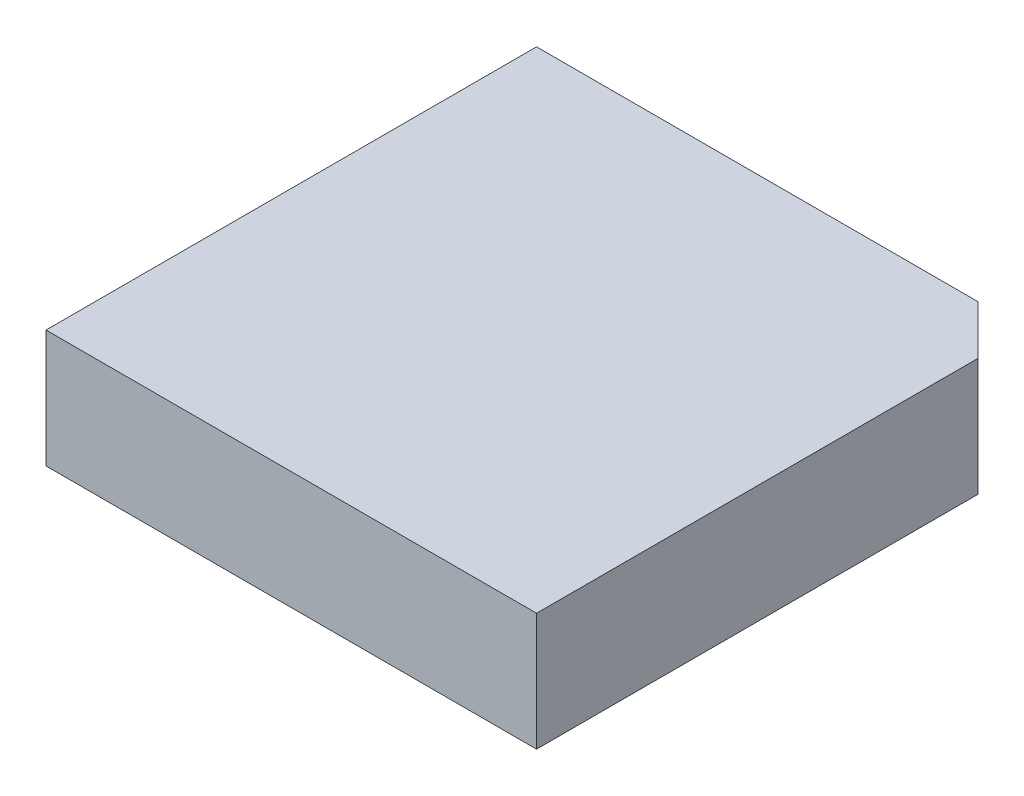
ISO-10303-21;
HEADER;
FILE_DESCRIPTION(('STEP AP214'),'2;1');
FILE_NAME('part.step','',(''),(''),'','','');
FILE_SCHEMA(('AUTOMOTIVE_DESIGN { 1 0 10303 214 1 1 1 1 }'));
ENDSEC;
DATA;
#1=APPLICATION_CONTEXT('core data for automotive mechanical design processes');
#2=APPLICATION_PROTOCOL_DEFINITION('international standard','automotive_design',2000,#1);
#3=PRODUCT_CONTEXT('',#1,'mechanical');
#4=PRODUCT('Part','Part','',(#3));
#5=PRODUCT_RELATED_PRODUCT_CATEGORY('part','',(#4));
#6=PRODUCT_DEFINITION_FORMATION('','',#4);
#7=PRODUCT_DEFINITION_CONTEXT('part definition',#1,'design');
#8=PRODUCT_DEFINITION('design','',#6,#7);
#9=PRODUCT_DEFINITION_SHAPE('','',#8);
#10=(LENGTH_UNIT() NAMED_UNIT(*) SI_UNIT(.MILLI.,.METRE.));
#11=(NAMED_UNIT(*) PLANE_ANGLE_UNIT() SI_UNIT($,.RADIAN.));
#12=(NAMED_UNIT(*) SI_UNIT($,.STERADIAN.) SOLID_ANGLE_UNIT());
#13=UNCERTAINTY_MEASURE_WITH_UNIT(LENGTH_MEASURE(1.E-05),#10,'distance_accuracy_value','');
#14=(GEOMETRIC_REPRESENTATION_CONTEXT(3) GLOBAL_UNCERTAINTY_ASSIGNED_CONTEXT((#13)) GLOBAL_UNIT_ASSIGNED_CONTEXT((#10,
#11,#12)) REPRESENTATION_CONTEXT('',''));
#15=CARTESIAN_POINT('',(0.,0.,0.));
#16=DIRECTION('',(0.,0.,1.));
#17=DIRECTION('',(1.,0.,0.));
#18=AXIS2_PLACEMENT_3D('',#15,#16,#17);
#19=CARTESIAN_POINT('',(0.,624.,0.));
#20=DIRECTION('',(0.,-1.,0.));
#21=DIRECTION('',(0.,0.,-1.));
#22=AXIS2_PLACEMENT_3D('',#19,#20,#21);
#23=PLANE('',#22);
#24=DIRECTION('',(-1.,0.,0.));
#25=VECTOR('',#24,1.);
#26=CARTESIAN_POINT('',(1275.,624.,-825.));
#27=LINE('',#26,#25);
#28=CARTESIAN_POINT('',(1275.,624.,-825.));
#29=VERTEX_POINT('',#28);
#30=CARTESIAN_POINT('',(1175.,624.,-825.));
#31=VERTEX_POINT('',#30);
#32=EDGE_CURVE('E123',#29,#31,#27,.T.);
#33=ORIENTED_EDGE('',*,*,#32,.F.);
#34=DIRECTION('',(0.,0.,1.));
#35=VECTOR('',#34,1.);
#36=CARTESIAN_POINT('',(1275.,624.,-915.));
#37=LINE('',#36,#35);
#38=CARTESIAN_POINT('',(1275.,624.,-915.));
#39=VERTEX_POINT('',#38);
#40=EDGE_CURVE('E136',#39,#29,#37,.T.);
#41=ORIENTED_EDGE('',*,*,#40,.F.);
#42=DIRECTION('',(0.707106781186547,0.,0.707106781186547));
#43=VECTOR('',#42,1.);
#44=CARTESIAN_POINT('',(1265.,624.,-925.));
#45=LINE('',#44,#43);
#46=CARTESIAN_POINT('',(1265.,624.,-925.));
#47=VERTEX_POINT('',#46);
#48=EDGE_CURVE('E133',#47,#39,#45,.T.);
#49=ORIENTED_EDGE('',*,*,#48,.F.);
#50=DIRECTION('',(1.,0.,0.));
#51=VECTOR('',#50,1.);
#52=CARTESIAN_POINT('',(1175.,624.,-925.));
#53=LINE('',#52,#51);
#54=CARTESIAN_POINT('',(1175.,624.,-925.));
#55=VERTEX_POINT('',#54);
#56=EDGE_CURVE('E127',#55,#47,#53,.T.);
#57=ORIENTED_EDGE('',*,*,#56,.F.);
#58=DIRECTION('',(0.,0.,-1.));
#59=VECTOR('',#58,1.);
#60=CARTESIAN_POINT('',(1175.,624.,-825.));
#61=LINE('',#60,#59);
#62=EDGE_CURVE('E117',#31,#55,#61,.T.);
#63=ORIENTED_EDGE('',*,*,#62,.F.);
#64=EDGE_LOOP('',(#33,#41,#49,#57,#63));
#65=FACE_BOUND('',#64,.T.);
#66=ADVANCED_FACE('F49',(#65),#23,.F.);
#67=CARTESIAN_POINT('',(-1275.,600.,50.));
#68=DIRECTION('',(0.,1.,0.));
#69=DIRECTION('',(0.,0.,1.));
#70=AXIS2_PLACEMENT_3D('',#67,#68,#69);
#71=PLANE('',#70);
#72=DIRECTION('',(0.,0.,1.));
#73=VECTOR('',#72,1.);
#74=CARTESIAN_POINT('',(1175.,600.,-925.));
#75=LINE('',#74,#73);
#76=CARTESIAN_POINT('',(1175.,600.,-925.));
#77=VERTEX_POINT('',#76);
#78=CARTESIAN_POINT('',(1175.,600.,-825.));
#79=VERTEX_POINT('',#78);
#80=EDGE_CURVE('E88',#77,#79,#75,.T.);
#81=ORIENTED_EDGE('',*,*,#80,.F.);
#82=DIRECTION('',(1.,0.,0.));
#83=VECTOR('',#82,1.);
#84=CARTESIAN_POINT('',(0.,600.,-925.));
#85=LINE('',#84,#83);
#86=CARTESIAN_POINT('',(1265.,600.,-925.));
#87=VERTEX_POINT('',#86);
#88=EDGE_CURVE('E53',#77,#87,#85,.T.);
#89=ORIENTED_EDGE('',*,*,#88,.T.);
#90=DIRECTION('',(-0.70710678118654,0.,-0.707106781186555));
#91=VECTOR('',#90,1.);
#92=CARTESIAN_POINT('',(1275.,600.,-915.));
#93=LINE('',#92,#91);
#94=CARTESIAN_POINT('',(1275.,600.,-915.));
#95=VERTEX_POINT('',#94);
#96=EDGE_CURVE('E140',#95,#87,#93,.T.);
#97=ORIENTED_EDGE('',*,*,#96,.F.);
#98=DIRECTION('',(0.,0.,-1.));
#99=VECTOR('',#98,1.);
#100=CARTESIAN_POINT('',(1275.,600.,915.));
#101=LINE('',#100,#99);
#102=CARTESIAN_POINT('',(1275.,600.,-825.));
#103=VERTEX_POINT('',#102);
#104=EDGE_CURVE('E144',#103,#95,#101,.T.);
#105=ORIENTED_EDGE('',*,*,#104,.F.);
#106=DIRECTION('',(1.,0.,0.));
#107=VECTOR('',#106,1.);
#108=CARTESIAN_POINT('',(1175.,600.,-825.));
#109=LINE('',#108,#107);
#110=EDGE_CURVE('E82',#79,#103,#109,.T.);
#111=ORIENTED_EDGE('',*,*,#110,.F.);
#112=EDGE_LOOP('',(#81,#89,#97,#105,#111));
#113=FACE_BOUND('',#112,.T.);
#114=ADVANCED_FACE('F51',(#113),#71,.F.);
#115=CARTESIAN_POINT('',(0.,500.,-925.));
#116=DIRECTION('',(0.,0.,1.));
#117=DIRECTION('',(1.,0.,0.));
#118=AXIS2_PLACEMENT_3D('',#115,#116,#117);
#119=PLANE('',#118);
#120=DIRECTION('',(0.,1.,0.));
#121=VECTOR('',#120,1.);
#122=CARTESIAN_POINT('',(1175.,600.,-925.));
#123=LINE('',#122,#121);
#124=EDGE_CURVE('E167',#55,#77,#123,.F.);
#125=ORIENTED_EDGE('',*,*,#124,.F.);
#126=ORIENTED_EDGE('',*,*,#56,.T.);
#127=DIRECTION('',(0.,1.,0.));
#128=VECTOR('',#127,1.);
#129=CARTESIAN_POINT('',(1265.,600.,-925.));
#130=LINE('',#129,#128);
#131=EDGE_CURVE('E60',#87,#47,#130,.T.);
#132=ORIENTED_EDGE('',*,*,#131,.F.);
#133=ORIENTED_EDGE('',*,*,#88,.F.);
#134=EDGE_LOOP('',(#125,#126,#132,#133));
#135=FACE_BOUND('',#134,.T.);
#136=ADVANCED_FACE('F172',(#135),#119,.F.);
#137=CARTESIAN_POINT('',(1175.,600.,-925.));
#138=DIRECTION('',(-1.,0.,0.));
#139=DIRECTION('',(0.,0.,1.));
#140=AXIS2_PLACEMENT_3D('',#137,#138,#139);
#141=PLANE('',#140);
#142=DIRECTION('',(0.,1.,0.));
#143=VECTOR('',#142,1.);
#144=CARTESIAN_POINT('',(1175.,600.,-825.));
#145=LINE('',#144,#143);
#146=EDGE_CURVE('E113',#31,#79,#145,.F.);
#147=ORIENTED_EDGE('',*,*,#146,.F.);
#148=ORIENTED_EDGE('',*,*,#62,.T.);
#149=ORIENTED_EDGE('',*,*,#124,.T.);
#150=ORIENTED_EDGE('',*,*,#80,.T.);
#151=EDGE_LOOP('',(#147,#148,#149,#150));
#152=FACE_BOUND('',#151,.T.);
#153=ADVANCED_FACE('F115',(#152),#141,.T.);
#154=CARTESIAN_POINT('',(1175.,600.,-825.));
#155=DIRECTION('',(0.,0.,1.));
#156=DIRECTION('',(1.,0.,0.));
#157=AXIS2_PLACEMENT_3D('',#154,#155,#156);
#158=PLANE('',#157);
#159=DIRECTION('',(0.,1.,0.));
#160=VECTOR('',#159,1.);
#161=CARTESIAN_POINT('',(1275.,600.,-825.));
#162=LINE('',#161,#160);
#163=EDGE_CURVE('E95',#29,#103,#162,.F.);
#164=ORIENTED_EDGE('',*,*,#163,.F.);
#165=ORIENTED_EDGE('',*,*,#32,.T.);
#166=ORIENTED_EDGE('',*,*,#146,.T.);
#167=ORIENTED_EDGE('',*,*,#110,.T.);
#168=EDGE_LOOP('',(#164,#165,#166,#167));
#169=FACE_BOUND('',#168,.T.);
#170=ADVANCED_FACE('F129',(#169),#158,.T.);
#171=CARTESIAN_POINT('',(1275.,600.,915.));
#172=DIRECTION('',(1.,0.,0.));
#173=DIRECTION('',(0.,0.,-1.));
#174=AXIS2_PLACEMENT_3D('',#171,#172,#173);
#175=PLANE('',#174);
#176=ORIENTED_EDGE('',*,*,#104,.T.);
#177=DIRECTION('',(0.,1.,0.));
#178=VECTOR('',#177,1.);
#179=CARTESIAN_POINT('',(1275.,600.,-915.));
#180=LINE('',#179,#178);
#181=EDGE_CURVE('E12',#39,#95,#180,.F.);
#182=ORIENTED_EDGE('',*,*,#181,.F.);
#183=ORIENTED_EDGE('',*,*,#40,.T.);
#184=ORIENTED_EDGE('',*,*,#163,.T.);
#185=EDGE_LOOP('',(#176,#182,#183,#184));
#186=FACE_BOUND('',#185,.T.);
#187=ADVANCED_FACE('F176',(#186),#175,.T.);
#188=CARTESIAN_POINT('',(1275.,600.,-915.));
#189=DIRECTION('',(0.707106781186555,0.,-0.70710678118654));
#190=DIRECTION('',(-0.70710678118654,0.,-0.707106781186555));
#191=AXIS2_PLACEMENT_3D('',#188,#189,#190);
#192=PLANE('',#191);
#193=ORIENTED_EDGE('',*,*,#131,.T.);
#194=ORIENTED_EDGE('',*,*,#48,.T.);
#195=ORIENTED_EDGE('',*,*,#181,.T.);
#196=ORIENTED_EDGE('',*,*,#96,.T.);
#197=EDGE_LOOP('',(#193,#194,#195,#196));
#198=FACE_BOUND('',#197,.T.);
#199=ADVANCED_FACE('F174',(#198),#192,.T.);
#200=CLOSED_SHELL('',(#66,#114,#136,#153,#170,#187,#199));
#201=MANIFOLD_SOLID_BREP('B2',#200);
#202=ADVANCED_BREP_SHAPE_REPRESENTATION('',(#18,#201),#14);
#203=SHAPE_DEFINITION_REPRESENTATION(#9,#202);
ENDSEC;
END-ISO-10303-21;
